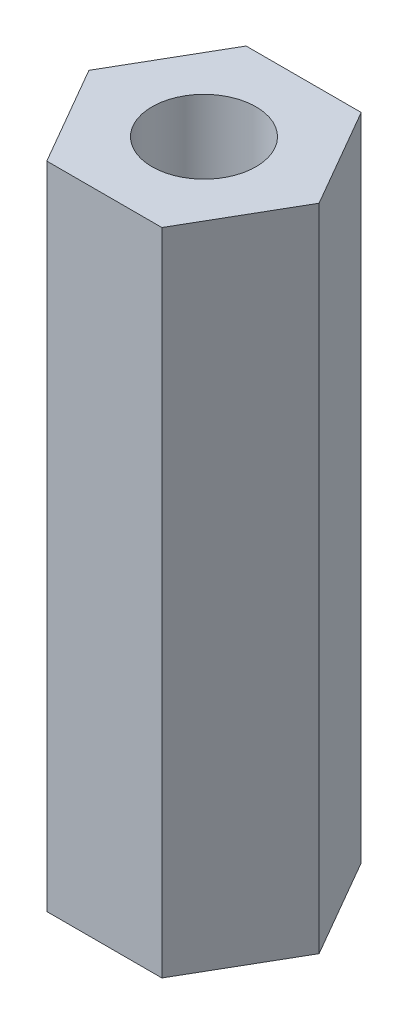
ISO-10303-21;
HEADER;
FILE_DESCRIPTION(('STEP AP214'),'2;1');
FILE_NAME('part.step','',(''),(''),'','','');
FILE_SCHEMA(('AUTOMOTIVE_DESIGN { 1 0 10303 214 1 1 1 1 }'));
ENDSEC;
DATA;
#1=APPLICATION_CONTEXT('core data for automotive mechanical design processes');
#2=APPLICATION_PROTOCOL_DEFINITION('international standard','automotive_design',2000,#1);
#3=PRODUCT_CONTEXT('',#1,'mechanical');
#4=PRODUCT('Part','Part','',(#3));
#5=PRODUCT_RELATED_PRODUCT_CATEGORY('part','',(#4));
#6=PRODUCT_DEFINITION_FORMATION('','',#4);
#7=PRODUCT_DEFINITION_CONTEXT('part definition',#1,'design');
#8=PRODUCT_DEFINITION('design','',#6,#7);
#9=PRODUCT_DEFINITION_SHAPE('','',#8);
#10=(LENGTH_UNIT() NAMED_UNIT(*) SI_UNIT(.MILLI.,.METRE.));
#11=(NAMED_UNIT(*) PLANE_ANGLE_UNIT() SI_UNIT($,.RADIAN.));
#12=(NAMED_UNIT(*) SI_UNIT($,.STERADIAN.) SOLID_ANGLE_UNIT());
#13=UNCERTAINTY_MEASURE_WITH_UNIT(LENGTH_MEASURE(1.E-05),#10,'distance_accuracy_value','');
#14=(GEOMETRIC_REPRESENTATION_CONTEXT(3) GLOBAL_UNCERTAINTY_ASSIGNED_CONTEXT((#13)) GLOBAL_UNIT_ASSIGNED_CONTEXT((#10,
#11,#12)) REPRESENTATION_CONTEXT('',''));
#15=CARTESIAN_POINT('',(0.,0.,0.));
#16=DIRECTION('',(0.,0.,1.));
#17=DIRECTION('',(1.,0.,0.));
#18=AXIS2_PLACEMENT_3D('',#15,#16,#17);
#19=CARTESIAN_POINT('',(0.,15.,0.));
#20=DIRECTION('',(0.,1.,0.));
#21=DIRECTION('',(0.,0.,1.));
#22=AXIS2_PLACEMENT_3D('',#19,#20,#21);
#23=PLANE('',#22);
#24=DIRECTION('',(0.5,0.,-0.866025403784439));
#25=VECTOR('',#24,1.);
#26=CARTESIAN_POINT('',(1.32790561913614,15.,2.3));
#27=LINE('',#26,#25);
#28=CARTESIAN_POINT('',(1.32790561913614,15.,2.3));
#29=VERTEX_POINT('',#28);
#30=CARTESIAN_POINT('',(2.65581123827228,15.,0.));
#31=VERTEX_POINT('',#30);
#32=EDGE_CURVE('E131',#29,#31,#27,.T.);
#33=ORIENTED_EDGE('',*,*,#32,.T.);
#34=DIRECTION('',(-0.5,0.,-0.866025403784438));
#35=VECTOR('',#34,1.);
#36=CARTESIAN_POINT('',(2.65581123827228,15.,0.));
#37=LINE('',#36,#35);
#38=CARTESIAN_POINT('',(1.32790561913614,15.,-2.3));
#39=VERTEX_POINT('',#38);
#40=EDGE_CURVE('E89',#31,#39,#37,.T.);
#41=ORIENTED_EDGE('',*,*,#40,.T.);
#42=DIRECTION('',(-1.,0.,0.));
#43=VECTOR('',#42,1.);
#44=CARTESIAN_POINT('',(1.32790561913614,15.,-2.3));
#45=LINE('',#44,#43);
#46=CARTESIAN_POINT('',(-1.32790561913614,15.,-2.3));
#47=VERTEX_POINT('',#46);
#48=EDGE_CURVE('E102',#39,#47,#45,.T.);
#49=ORIENTED_EDGE('',*,*,#48,.T.);
#50=DIRECTION('',(-0.5,0.,0.866025403784438));
#51=VECTOR('',#50,1.);
#52=CARTESIAN_POINT('',(-1.32790561913614,15.,-2.3));
#53=LINE('',#52,#51);
#54=CARTESIAN_POINT('',(-2.65581123827228,15.,0.));
#55=VERTEX_POINT('',#54);
#56=EDGE_CURVE('E96',#47,#55,#53,.T.);
#57=ORIENTED_EDGE('',*,*,#56,.T.);
#58=DIRECTION('',(0.5,0.,0.866025403784438));
#59=VECTOR('',#58,1.);
#60=CARTESIAN_POINT('',(-2.65581123827228,15.,0.));
#61=LINE('',#60,#59);
#62=CARTESIAN_POINT('',(-1.32790561913614,15.,2.3));
#63=VERTEX_POINT('',#62);
#64=EDGE_CURVE('E100',#55,#63,#61,.T.);
#65=ORIENTED_EDGE('',*,*,#64,.T.);
#66=DIRECTION('',(1.,0.,0.));
#67=VECTOR('',#66,1.);
#68=CARTESIAN_POINT('',(-1.32790561913614,15.,2.3));
#69=LINE('',#68,#67);
#70=EDGE_CURVE('E52',#63,#29,#69,.T.);
#71=ORIENTED_EDGE('',*,*,#70,.T.);
#72=EDGE_LOOP('',(#33,#41,#49,#57,#65,#71));
#73=FACE_BOUND('',#72,.T.);
#74=CARTESIAN_POINT('',(0.,15.,0.));
#75=DIRECTION('',(0.,1.,0.));
#76=DIRECTION('',(0.,0.,1.));
#77=AXIS2_PLACEMENT_3D('',#74,#75,#76);
#78=CIRCLE('',#77,1.2);
#79=CARTESIAN_POINT('',(0.,15.,1.2));
#80=VERTEX_POINT('',#79);
#81=EDGE_CURVE('E124',#80,#80,#78,.T.);
#82=ORIENTED_EDGE('',*,*,#81,.F.);
#83=EDGE_LOOP('',(#82));
#84=FACE_BOUND('',#83,.T.);
#85=ADVANCED_FACE('F35',(#73,#84),#23,.T.);
#86=CARTESIAN_POINT('',(0.,0.,0.));
#87=DIRECTION('',(0.,1.,0.));
#88=DIRECTION('',(0.,0.,1.));
#89=AXIS2_PLACEMENT_3D('',#86,#87,#88);
#90=PLANE('',#89);
#91=DIRECTION('',(0.5,0.,-0.866025403784439));
#92=VECTOR('',#91,1.);
#93=CARTESIAN_POINT('',(1.32790561913614,0.,2.3));
#94=LINE('',#93,#92);
#95=CARTESIAN_POINT('',(1.32790561913614,0.,2.3));
#96=VERTEX_POINT('',#95);
#97=CARTESIAN_POINT('',(2.65581123827228,0.,0.));
#98=VERTEX_POINT('',#97);
#99=EDGE_CURVE('E120',#96,#98,#94,.T.);
#100=ORIENTED_EDGE('',*,*,#99,.F.);
#101=DIRECTION('',(1.,0.,0.));
#102=VECTOR('',#101,1.);
#103=CARTESIAN_POINT('',(-1.32790561913614,0.,2.3));
#104=LINE('',#103,#102);
#105=CARTESIAN_POINT('',(-1.32790561913614,0.,2.3));
#106=VERTEX_POINT('',#105);
#107=EDGE_CURVE('E81',#106,#96,#104,.T.);
#108=ORIENTED_EDGE('',*,*,#107,.F.);
#109=DIRECTION('',(0.5,0.,0.866025403784438));
#110=VECTOR('',#109,1.);
#111=CARTESIAN_POINT('',(-2.65581123827228,0.,0.));
#112=LINE('',#111,#110);
#113=CARTESIAN_POINT('',(-2.65581123827228,0.,0.));
#114=VERTEX_POINT('',#113);
#115=EDGE_CURVE('E75',#114,#106,#112,.T.);
#116=ORIENTED_EDGE('',*,*,#115,.F.);
#117=DIRECTION('',(-0.5,0.,0.866025403784438));
#118=VECTOR('',#117,1.);
#119=CARTESIAN_POINT('',(-1.32790561913614,0.,-2.3));
#120=LINE('',#119,#118);
#121=CARTESIAN_POINT('',(-1.32790561913614,0.,-2.3));
#122=VERTEX_POINT('',#121);
#123=EDGE_CURVE('E110',#122,#114,#120,.T.);
#124=ORIENTED_EDGE('',*,*,#123,.F.);
#125=DIRECTION('',(-1.,0.,0.));
#126=VECTOR('',#125,1.);
#127=CARTESIAN_POINT('',(1.32790561913614,0.,-2.3));
#128=LINE('',#127,#126);
#129=CARTESIAN_POINT('',(1.32790561913614,0.,-2.3));
#130=VERTEX_POINT('',#129);
#131=EDGE_CURVE('E126',#130,#122,#128,.T.);
#132=ORIENTED_EDGE('',*,*,#131,.F.);
#133=DIRECTION('',(-0.5,0.,-0.866025403784438));
#134=VECTOR('',#133,1.);
#135=CARTESIAN_POINT('',(2.65581123827228,0.,0.));
#136=LINE('',#135,#134);
#137=EDGE_CURVE('E123',#98,#130,#136,.T.);
#138=ORIENTED_EDGE('',*,*,#137,.F.);
#139=EDGE_LOOP('',(#100,#108,#116,#124,#132,#138));
#140=FACE_BOUND('',#139,.T.);
#141=CARTESIAN_POINT('',(0.,0.,0.));
#142=DIRECTION('',(0.,1.,0.));
#143=DIRECTION('',(0.,0.,1.));
#144=AXIS2_PLACEMENT_3D('',#141,#142,#143);
#145=CIRCLE('',#144,1.2);
#146=CARTESIAN_POINT('',(0.,0.,1.2));
#147=VERTEX_POINT('',#146);
#148=EDGE_CURVE('E224',#147,#147,#145,.T.);
#149=ORIENTED_EDGE('',*,*,#148,.T.);
#150=EDGE_LOOP('',(#149));
#151=FACE_BOUND('',#150,.T.);
#152=ADVANCED_FACE('F140',(#140,#151),#90,.F.);
#153=CARTESIAN_POINT('',(1.32790561913614,15.,2.3));
#154=DIRECTION('',(-0.866025403784439,0.,-0.5));
#155=DIRECTION('',(-0.5,0.,0.866025403784439));
#156=AXIS2_PLACEMENT_3D('',#153,#154,#155);
#157=PLANE('',#156);
#158=ORIENTED_EDGE('',*,*,#99,.T.);
#159=DIRECTION('',(0.,-1.,0.));
#160=VECTOR('',#159,1.);
#161=CARTESIAN_POINT('',(2.65581123827228,15.,0.));
#162=LINE('',#161,#160);
#163=EDGE_CURVE('E11',#31,#98,#162,.T.);
#164=ORIENTED_EDGE('',*,*,#163,.F.);
#165=ORIENTED_EDGE('',*,*,#32,.F.);
#166=DIRECTION('',(0.,-1.,0.));
#167=VECTOR('',#166,1.);
#168=CARTESIAN_POINT('',(1.32790561913614,15.,2.3));
#169=LINE('',#168,#167);
#170=EDGE_CURVE('E116',#29,#96,#169,.T.);
#171=ORIENTED_EDGE('',*,*,#170,.T.);
#172=EDGE_LOOP('',(#158,#164,#165,#171));
#173=FACE_BOUND('',#172,.T.);
#174=ADVANCED_FACE('F37',(#173),#157,.F.);
#175=CARTESIAN_POINT('',(2.65581123827228,15.,0.));
#176=DIRECTION('',(-0.866025403784438,0.,0.5));
#177=DIRECTION('',(0.5,0.,0.866025403784438));
#178=AXIS2_PLACEMENT_3D('',#175,#176,#177);
#179=PLANE('',#178);
#180=ORIENTED_EDGE('',*,*,#137,.T.);
#181=DIRECTION('',(0.,-1.,0.));
#182=VECTOR('',#181,1.);
#183=CARTESIAN_POINT('',(1.32790561913614,15.,-2.3));
#184=LINE('',#183,#182);
#185=EDGE_CURVE('E44',#39,#130,#184,.T.);
#186=ORIENTED_EDGE('',*,*,#185,.F.);
#187=ORIENTED_EDGE('',*,*,#40,.F.);
#188=ORIENTED_EDGE('',*,*,#163,.T.);
#189=EDGE_LOOP('',(#180,#186,#187,#188));
#190=FACE_BOUND('',#189,.T.);
#191=ADVANCED_FACE('F165',(#190),#179,.F.);
#192=CARTESIAN_POINT('',(1.32790561913614,15.,-2.3));
#193=DIRECTION('',(0.,0.,1.));
#194=DIRECTION('',(1.,0.,0.));
#195=AXIS2_PLACEMENT_3D('',#192,#193,#194);
#196=PLANE('',#195);
#197=ORIENTED_EDGE('',*,*,#131,.T.);
#198=DIRECTION('',(0.,-1.,0.));
#199=VECTOR('',#198,1.);
#200=CARTESIAN_POINT('',(-1.32790561913614,15.,-2.3));
#201=LINE('',#200,#199);
#202=EDGE_CURVE('E111',#47,#122,#201,.T.);
#203=ORIENTED_EDGE('',*,*,#202,.F.);
#204=ORIENTED_EDGE('',*,*,#48,.F.);
#205=ORIENTED_EDGE('',*,*,#185,.T.);
#206=EDGE_LOOP('',(#197,#203,#204,#205));
#207=FACE_BOUND('',#206,.T.);
#208=ADVANCED_FACE('F137',(#207),#196,.F.);
#209=CARTESIAN_POINT('',(-1.32790561913614,15.,-2.3));
#210=DIRECTION('',(0.866025403784439,0.,0.5));
#211=DIRECTION('',(0.5,0.,-0.866025403784439));
#212=AXIS2_PLACEMENT_3D('',#209,#210,#211);
#213=PLANE('',#212);
#214=ORIENTED_EDGE('',*,*,#123,.T.);
#215=DIRECTION('',(0.,-1.,0.));
#216=VECTOR('',#215,1.);
#217=CARTESIAN_POINT('',(-2.65581123827228,15.,0.));
#218=LINE('',#217,#216);
#219=EDGE_CURVE('E107',#55,#114,#218,.T.);
#220=ORIENTED_EDGE('',*,*,#219,.F.);
#221=ORIENTED_EDGE('',*,*,#56,.F.);
#222=ORIENTED_EDGE('',*,*,#202,.T.);
#223=EDGE_LOOP('',(#214,#220,#221,#222));
#224=FACE_BOUND('',#223,.T.);
#225=ADVANCED_FACE('F108',(#224),#213,.F.);
#226=CARTESIAN_POINT('',(-2.65581123827228,15.,0.));
#227=DIRECTION('',(0.866025403784438,0.,-0.5));
#228=DIRECTION('',(-0.5,0.,-0.866025403784438));
#229=AXIS2_PLACEMENT_3D('',#226,#227,#228);
#230=PLANE('',#229);
#231=ORIENTED_EDGE('',*,*,#115,.T.);
#232=DIRECTION('',(0.,-1.,0.));
#233=VECTOR('',#232,1.);
#234=CARTESIAN_POINT('',(-1.32790561913614,15.,2.3));
#235=LINE('',#234,#233);
#236=EDGE_CURVE('E112',#63,#106,#235,.T.);
#237=ORIENTED_EDGE('',*,*,#236,.F.);
#238=ORIENTED_EDGE('',*,*,#64,.F.);
#239=ORIENTED_EDGE('',*,*,#219,.T.);
#240=EDGE_LOOP('',(#231,#237,#238,#239));
#241=FACE_BOUND('',#240,.T.);
#242=ADVANCED_FACE('F114',(#241),#230,.F.);
#243=CARTESIAN_POINT('',(-1.32790561913614,15.,2.3));
#244=DIRECTION('',(0.,0.,-1.));
#245=DIRECTION('',(-1.,0.,0.));
#246=AXIS2_PLACEMENT_3D('',#243,#244,#245);
#247=PLANE('',#246);
#248=ORIENTED_EDGE('',*,*,#107,.T.);
#249=ORIENTED_EDGE('',*,*,#170,.F.);
#250=ORIENTED_EDGE('',*,*,#70,.F.);
#251=ORIENTED_EDGE('',*,*,#236,.T.);
#252=EDGE_LOOP('',(#248,#249,#250,#251));
#253=FACE_BOUND('',#252,.T.);
#254=ADVANCED_FACE('F145',(#253),#247,.F.);
#255=CARTESIAN_POINT('',(0.,15.,0.));
#256=DIRECTION('',(0.,-1.,0.));
#257=DIRECTION('',(0.,0.,-1.));
#258=AXIS2_PLACEMENT_3D('',#255,#256,#257);
#259=CYLINDRICAL_SURFACE('',#258,1.2);
#260=ORIENTED_EDGE('',*,*,#81,.T.);
#261=EDGE_LOOP('',(#260));
#262=FACE_BOUND('',#261,.T.);
#263=ORIENTED_EDGE('',*,*,#148,.F.);
#264=EDGE_LOOP('',(#263));
#265=FACE_BOUND('',#264,.T.);
#266=ADVANCED_FACE('F147',(#262,#265),#259,.F.);
#267=CLOSED_SHELL('',(#85,#152,#174,#191,#208,#225,#242,#254,#266));
#268=MANIFOLD_SOLID_BREP('B2',#267);
#269=ADVANCED_BREP_SHAPE_REPRESENTATION('',(#18,#268),#14);
#270=SHAPE_DEFINITION_REPRESENTATION(#9,#269);
ENDSEC;
END-ISO-10303-21;
